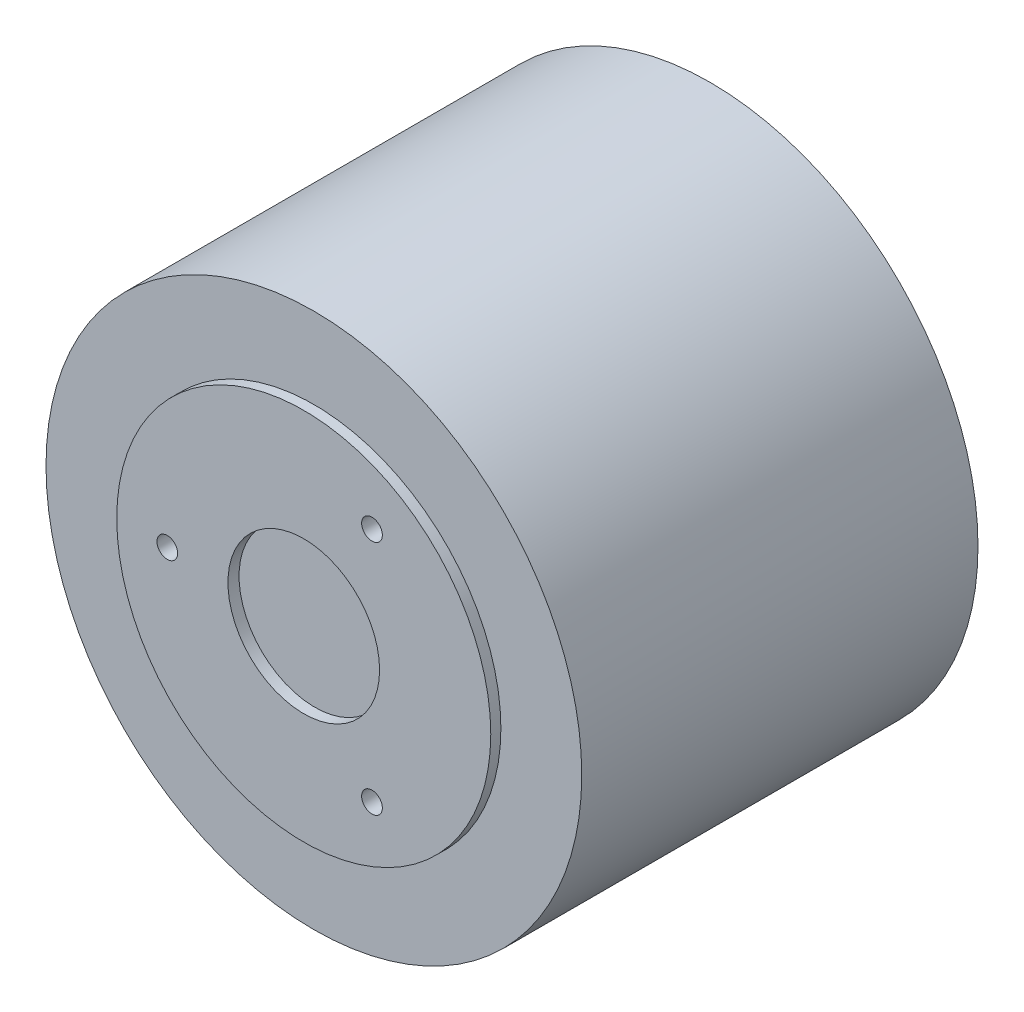
ISO-10303-21;
HEADER;
FILE_DESCRIPTION(('STEP AP214'),'2;1');
FILE_NAME('part.step','',(''),(''),'','','');
FILE_SCHEMA(('AUTOMOTIVE_DESIGN { 1 0 10303 214 1 1 1 1 }'));
ENDSEC;
DATA;
#1=APPLICATION_CONTEXT('core data for automotive mechanical design processes');
#2=APPLICATION_PROTOCOL_DEFINITION('international standard','automotive_design',2000,#1);
#3=PRODUCT_CONTEXT('',#1,'mechanical');
#4=PRODUCT('Part','Part','',(#3));
#5=PRODUCT_RELATED_PRODUCT_CATEGORY('part','',(#4));
#6=PRODUCT_DEFINITION_FORMATION('','',#4);
#7=PRODUCT_DEFINITION_CONTEXT('part definition',#1,'design');
#8=PRODUCT_DEFINITION('design','',#6,#7);
#9=PRODUCT_DEFINITION_SHAPE('','',#8);
#10=(LENGTH_UNIT() NAMED_UNIT(*) SI_UNIT(.MILLI.,.METRE.));
#11=(NAMED_UNIT(*) PLANE_ANGLE_UNIT() SI_UNIT($,.RADIAN.));
#12=(NAMED_UNIT(*) SI_UNIT($,.STERADIAN.) SOLID_ANGLE_UNIT());
#13=UNCERTAINTY_MEASURE_WITH_UNIT(LENGTH_MEASURE(1.E-05),#10,'distance_accuracy_value','');
#14=(GEOMETRIC_REPRESENTATION_CONTEXT(3) GLOBAL_UNCERTAINTY_ASSIGNED_CONTEXT((#13)) GLOBAL_UNIT_ASSIGNED_CONTEXT((#10,
#11,#12)) REPRESENTATION_CONTEXT('',''));
#15=CARTESIAN_POINT('',(0.,0.,0.));
#16=DIRECTION('',(0.,0.,1.));
#17=DIRECTION('',(1.,0.,0.));
#18=AXIS2_PLACEMENT_3D('',#15,#16,#17);
#19=CARTESIAN_POINT('',(0.,0.,-1.));
#20=DIRECTION('',(0.,0.,-1.));
#21=DIRECTION('',(-1.,0.,0.));
#22=AXIS2_PLACEMENT_3D('',#19,#20,#21);
#23=CYLINDRICAL_SURFACE('',#22,26.5);
#24=CARTESIAN_POINT('',(0.,0.,-1.));
#25=DIRECTION('',(0.,0.,1.));
#26=DIRECTION('',(1.,0.,0.));
#27=AXIS2_PLACEMENT_3D('',#24,#25,#26);
#28=CIRCLE('',#27,26.5);
#29=CARTESIAN_POINT('',(26.5,0.,-1.));
#30=VERTEX_POINT('',#29);
#31=EDGE_CURVE('E10',#30,#30,#28,.T.);
#32=ORIENTED_EDGE('',*,*,#31,.F.);
#33=EDGE_LOOP('',(#32));
#34=FACE_BOUND('',#33,.T.);
#35=CARTESIAN_POINT('',(0.,0.,-40.2));
#36=DIRECTION('',(0.,0.,1.));
#37=DIRECTION('',(1.,0.,0.));
#38=AXIS2_PLACEMENT_3D('',#35,#36,#37);
#39=CIRCLE('',#38,26.5);
#40=CARTESIAN_POINT('',(26.5,0.,-40.2));
#41=VERTEX_POINT('',#40);
#42=EDGE_CURVE('E48',#41,#41,#39,.T.);
#43=ORIENTED_EDGE('',*,*,#42,.T.);
#44=EDGE_LOOP('',(#43));
#45=FACE_BOUND('',#44,.T.);
#46=ADVANCED_FACE('F41',(#34,#45),#23,.T.);
#47=CARTESIAN_POINT('',(0.,0.,-1.));
#48=DIRECTION('',(0.,0.,1.));
#49=DIRECTION('',(1.,0.,0.));
#50=AXIS2_PLACEMENT_3D('',#47,#48,#49);
#51=PLANE('',#50);
#52=CARTESIAN_POINT('',(0.,0.,-1.));
#53=DIRECTION('',(0.,0.,1.));
#54=DIRECTION('',(1.,0.,0.));
#55=AXIS2_PLACEMENT_3D('',#52,#53,#54);
#56=CIRCLE('',#55,18.5);
#57=CARTESIAN_POINT('',(18.5,0.,-1.));
#58=VERTEX_POINT('',#57);
#59=EDGE_CURVE('E44',#58,#58,#56,.F.);
#60=ORIENTED_EDGE('',*,*,#59,.T.);
#61=EDGE_LOOP('',(#60));
#62=FACE_BOUND('',#61,.T.);
#63=ORIENTED_EDGE('',*,*,#31,.T.);
#64=EDGE_LOOP('',(#63));
#65=FACE_BOUND('',#64,.T.);
#66=ADVANCED_FACE('F118',(#62,#65),#51,.T.);
#67=CARTESIAN_POINT('',(0.,0.,-40.2));
#68=DIRECTION('',(0.,0.,1.));
#69=DIRECTION('',(1.,0.,0.));
#70=AXIS2_PLACEMENT_3D('',#67,#68,#69);
#71=PLANE('',#70);
#72=CARTESIAN_POINT('',(-23.5,0.,-40.2));
#73=DIRECTION('',(0.,0.,1.));
#74=DIRECTION('',(1.,0.,0.));
#75=AXIS2_PLACEMENT_3D('',#72,#73,#74);
#76=CIRCLE('',#75,1.025);
#77=CARTESIAN_POINT('',(-22.475,0.,-40.2));
#78=VERTEX_POINT('',#77);
#79=EDGE_CURVE('E100',#78,#78,#76,.T.);
#80=ORIENTED_EDGE('',*,*,#79,.T.);
#81=EDGE_LOOP('',(#80));
#82=FACE_BOUND('',#81,.T.);
#83=CARTESIAN_POINT('',(0.,-23.5,-40.2));
#84=DIRECTION('',(0.,0.,1.));
#85=DIRECTION('',(1.,0.,0.));
#86=AXIS2_PLACEMENT_3D('',#83,#84,#85);
#87=CIRCLE('',#86,1.025);
#88=CARTESIAN_POINT('',(1.025,-23.5,-40.2));
#89=VERTEX_POINT('',#88);
#90=EDGE_CURVE('E94',#89,#89,#87,.T.);
#91=ORIENTED_EDGE('',*,*,#90,.T.);
#92=EDGE_LOOP('',(#91));
#93=FACE_BOUND('',#92,.T.);
#94=CARTESIAN_POINT('',(23.5,0.,-40.2));
#95=DIRECTION('',(0.,0.,1.));
#96=DIRECTION('',(1.,0.,0.));
#97=AXIS2_PLACEMENT_3D('',#94,#95,#96);
#98=CIRCLE('',#97,1.025);
#99=CARTESIAN_POINT('',(24.525,0.,-40.2));
#100=VERTEX_POINT('',#99);
#101=EDGE_CURVE('E88',#100,#100,#98,.T.);
#102=ORIENTED_EDGE('',*,*,#101,.T.);
#103=EDGE_LOOP('',(#102));
#104=FACE_BOUND('',#103,.T.);
#105=CARTESIAN_POINT('',(0.,23.5,-40.2));
#106=DIRECTION('',(0.,0.,1.));
#107=DIRECTION('',(1.,0.,0.));
#108=AXIS2_PLACEMENT_3D('',#105,#106,#107);
#109=CIRCLE('',#108,1.025);
#110=CARTESIAN_POINT('',(1.025,23.5,-40.2));
#111=VERTEX_POINT('',#110);
#112=EDGE_CURVE('E82',#111,#111,#109,.T.);
#113=ORIENTED_EDGE('',*,*,#112,.T.);
#114=EDGE_LOOP('',(#113));
#115=FACE_BOUND('',#114,.T.);
#116=ORIENTED_EDGE('',*,*,#42,.F.);
#117=EDGE_LOOP('',(#116));
#118=FACE_BOUND('',#117,.T.);
#119=ADVANCED_FACE('F123',(#82,#93,#104,#115,#118),#71,.F.);
#120=CARTESIAN_POINT('',(0.,0.,0.));
#121=DIRECTION('',(0.,0.,-1.));
#122=DIRECTION('',(-1.,0.,0.));
#123=AXIS2_PLACEMENT_3D('',#120,#121,#122);
#124=CYLINDRICAL_SURFACE('',#123,18.5);
#125=ORIENTED_EDGE('',*,*,#59,.F.);
#126=EDGE_LOOP('',(#125));
#127=FACE_BOUND('',#126,.T.);
#128=CARTESIAN_POINT('',(0.,0.,0.));
#129=DIRECTION('',(0.,0.,1.));
#130=DIRECTION('',(1.,0.,0.));
#131=AXIS2_PLACEMENT_3D('',#128,#129,#130);
#132=CIRCLE('',#131,18.5);
#133=CARTESIAN_POINT('',(18.5,0.,0.));
#134=VERTEX_POINT('',#133);
#135=EDGE_CURVE('E54',#134,#134,#132,.T.);
#136=ORIENTED_EDGE('',*,*,#135,.F.);
#137=EDGE_LOOP('',(#136));
#138=FACE_BOUND('',#137,.T.);
#139=ADVANCED_FACE('F130',(#127,#138),#124,.T.);
#140=CARTESIAN_POINT('',(0.,0.,0.));
#141=DIRECTION('',(0.,0.,1.));
#142=DIRECTION('',(1.,0.,0.));
#143=AXIS2_PLACEMENT_3D('',#140,#141,#142);
#144=PLANE('',#143);
#145=CARTESIAN_POINT('',(-13.5,0.,0.));
#146=DIRECTION('',(0.,0.,1.));
#147=DIRECTION('',(1.,0.,0.));
#148=AXIS2_PLACEMENT_3D('',#145,#146,#147);
#149=CIRCLE('',#148,1.025);
#150=CARTESIAN_POINT('',(-12.475,0.,0.));
#151=VERTEX_POINT('',#150);
#152=EDGE_CURVE('E73',#151,#151,#149,.T.);
#153=ORIENTED_EDGE('',*,*,#152,.F.);
#154=EDGE_LOOP('',(#153));
#155=FACE_BOUND('',#154,.T.);
#156=CARTESIAN_POINT('',(6.75,-11.6913429510899,0.));
#157=DIRECTION('',(0.,0.,1.));
#158=DIRECTION('',(1.,0.,0.));
#159=AXIS2_PLACEMENT_3D('',#156,#157,#158);
#160=CIRCLE('',#159,1.025);
#161=CARTESIAN_POINT('',(7.775,-11.6913429510899,0.));
#162=VERTEX_POINT('',#161);
#163=EDGE_CURVE('E67',#162,#162,#160,.T.);
#164=ORIENTED_EDGE('',*,*,#163,.F.);
#165=EDGE_LOOP('',(#164));
#166=FACE_BOUND('',#165,.T.);
#167=CARTESIAN_POINT('',(6.75,11.6913429510899,0.));
#168=DIRECTION('',(0.,0.,1.));
#169=DIRECTION('',(1.,0.,0.));
#170=AXIS2_PLACEMENT_3D('',#167,#168,#169);
#171=CIRCLE('',#170,1.025);
#172=CARTESIAN_POINT('',(7.775,11.6913429510899,0.));
#173=VERTEX_POINT('',#172);
#174=EDGE_CURVE('E61',#173,#173,#171,.T.);
#175=ORIENTED_EDGE('',*,*,#174,.F.);
#176=EDGE_LOOP('',(#175));
#177=FACE_BOUND('',#176,.T.);
#178=CARTESIAN_POINT('',(0.,0.,0.));
#179=DIRECTION('',(0.,0.,1.));
#180=DIRECTION('',(1.,0.,0.));
#181=AXIS2_PLACEMENT_3D('',#178,#179,#180);
#182=CIRCLE('',#181,7.5);
#183=CARTESIAN_POINT('',(7.5,0.,0.));
#184=VERTEX_POINT('',#183);
#185=EDGE_CURVE('E57',#184,#184,#182,.T.);
#186=ORIENTED_EDGE('',*,*,#185,.F.);
#187=EDGE_LOOP('',(#186));
#188=FACE_BOUND('',#187,.T.);
#189=ORIENTED_EDGE('',*,*,#135,.T.);
#190=EDGE_LOOP('',(#189));
#191=FACE_BOUND('',#190,.T.);
#192=ADVANCED_FACE('F135',(#155,#166,#177,#188,#191),#144,.T.);
#193=CARTESIAN_POINT('',(0.,0.,0.));
#194=DIRECTION('',(0.,0.,-1.));
#195=DIRECTION('',(-1.,0.,0.));
#196=AXIS2_PLACEMENT_3D('',#193,#194,#195);
#197=CYLINDRICAL_SURFACE('',#196,7.5);
#198=ORIENTED_EDGE('',*,*,#185,.T.);
#199=EDGE_LOOP('',(#198));
#200=FACE_BOUND('',#199,.T.);
#201=CARTESIAN_POINT('',(0.,0.,-1.1));
#202=DIRECTION('',(0.,0.,1.));
#203=DIRECTION('',(1.,0.,0.));
#204=AXIS2_PLACEMENT_3D('',#201,#202,#203);
#205=CIRCLE('',#204,7.5);
#206=CARTESIAN_POINT('',(7.5,0.,-1.1));
#207=VERTEX_POINT('',#206);
#208=EDGE_CURVE('E58',#207,#207,#205,.T.);
#209=ORIENTED_EDGE('',*,*,#208,.F.);
#210=EDGE_LOOP('',(#209));
#211=FACE_BOUND('',#210,.T.);
#212=ADVANCED_FACE('F142',(#200,#211),#197,.F.);
#213=CARTESIAN_POINT('',(0.,0.,-1.1));
#214=DIRECTION('',(0.,0.,1.));
#215=DIRECTION('',(1.,0.,0.));
#216=AXIS2_PLACEMENT_3D('',#213,#214,#215);
#217=PLANE('',#216);
#218=ORIENTED_EDGE('',*,*,#208,.T.);
#219=EDGE_LOOP('',(#218));
#220=FACE_BOUND('',#219,.T.);
#221=ADVANCED_FACE('F146',(#220),#217,.T.);
#222=CARTESIAN_POINT('',(6.75,11.6913429510899,0.));
#223=DIRECTION('',(0.,0.,-1.));
#224=DIRECTION('',(-1.,0.,0.));
#225=AXIS2_PLACEMENT_3D('',#222,#223,#224);
#226=CYLINDRICAL_SURFACE('',#225,1.025);
#227=ORIENTED_EDGE('',*,*,#174,.T.);
#228=EDGE_LOOP('',(#227));
#229=FACE_BOUND('',#228,.T.);
#230=CARTESIAN_POINT('',(6.75,11.6913429510899,-3.));
#231=DIRECTION('',(0.,0.,1.));
#232=DIRECTION('',(1.,0.,0.));
#233=AXIS2_PLACEMENT_3D('',#230,#231,#232);
#234=CIRCLE('',#233,1.025);
#235=CARTESIAN_POINT('',(7.775,11.6913429510899,-3.));
#236=VERTEX_POINT('',#235);
#237=EDGE_CURVE('E64',#236,#236,#234,.T.);
#238=ORIENTED_EDGE('',*,*,#237,.F.);
#239=EDGE_LOOP('',(#238));
#240=FACE_BOUND('',#239,.T.);
#241=ADVANCED_FACE('F150',(#229,#240),#226,.F.);
#242=CARTESIAN_POINT('',(6.75,11.6913429510899,-3.));
#243=DIRECTION('',(0.,0.,1.));
#244=DIRECTION('',(1.,0.,0.));
#245=AXIS2_PLACEMENT_3D('',#242,#243,#244);
#246=PLANE('',#245);
#247=ORIENTED_EDGE('',*,*,#237,.T.);
#248=EDGE_LOOP('',(#247));
#249=FACE_BOUND('',#248,.T.);
#250=ADVANCED_FACE('F154',(#249),#246,.T.);
#251=CARTESIAN_POINT('',(6.75,-11.6913429510899,0.));
#252=DIRECTION('',(0.,0.,-1.));
#253=DIRECTION('',(-1.,0.,0.));
#254=AXIS2_PLACEMENT_3D('',#251,#252,#253);
#255=CYLINDRICAL_SURFACE('',#254,1.025);
#256=ORIENTED_EDGE('',*,*,#163,.T.);
#257=EDGE_LOOP('',(#256));
#258=FACE_BOUND('',#257,.T.);
#259=CARTESIAN_POINT('',(6.75,-11.6913429510899,-3.));
#260=DIRECTION('',(0.,0.,1.));
#261=DIRECTION('',(1.,0.,0.));
#262=AXIS2_PLACEMENT_3D('',#259,#260,#261);
#263=CIRCLE('',#262,1.025);
#264=CARTESIAN_POINT('',(7.775,-11.6913429510899,-3.));
#265=VERTEX_POINT('',#264);
#266=EDGE_CURVE('E70',#265,#265,#263,.T.);
#267=ORIENTED_EDGE('',*,*,#266,.F.);
#268=EDGE_LOOP('',(#267));
#269=FACE_BOUND('',#268,.T.);
#270=ADVANCED_FACE('F158',(#258,#269),#255,.F.);
#271=CARTESIAN_POINT('',(6.75,-11.6913429510899,-3.));
#272=DIRECTION('',(0.,0.,1.));
#273=DIRECTION('',(1.,0.,0.));
#274=AXIS2_PLACEMENT_3D('',#271,#272,#273);
#275=PLANE('',#274);
#276=ORIENTED_EDGE('',*,*,#266,.T.);
#277=EDGE_LOOP('',(#276));
#278=FACE_BOUND('',#277,.T.);
#279=ADVANCED_FACE('F162',(#278),#275,.T.);
#280=CARTESIAN_POINT('',(-13.5,0.,0.));
#281=DIRECTION('',(0.,0.,-1.));
#282=DIRECTION('',(-1.,0.,0.));
#283=AXIS2_PLACEMENT_3D('',#280,#281,#282);
#284=CYLINDRICAL_SURFACE('',#283,1.025);
#285=ORIENTED_EDGE('',*,*,#152,.T.);
#286=EDGE_LOOP('',(#285));
#287=FACE_BOUND('',#286,.T.);
#288=CARTESIAN_POINT('',(-13.5,0.,-3.));
#289=DIRECTION('',(0.,0.,1.));
#290=DIRECTION('',(1.,0.,0.));
#291=AXIS2_PLACEMENT_3D('',#288,#289,#290);
#292=CIRCLE('',#291,1.025);
#293=CARTESIAN_POINT('',(-12.475,0.,-3.));
#294=VERTEX_POINT('',#293);
#295=EDGE_CURVE('E76',#294,#294,#292,.T.);
#296=ORIENTED_EDGE('',*,*,#295,.F.);
#297=EDGE_LOOP('',(#296));
#298=FACE_BOUND('',#297,.T.);
#299=ADVANCED_FACE('F166',(#287,#298),#284,.F.);
#300=CARTESIAN_POINT('',(-13.5,0.,-3.));
#301=DIRECTION('',(0.,0.,1.));
#302=DIRECTION('',(1.,0.,0.));
#303=AXIS2_PLACEMENT_3D('',#300,#301,#302);
#304=PLANE('',#303);
#305=ORIENTED_EDGE('',*,*,#295,.T.);
#306=EDGE_LOOP('',(#305));
#307=FACE_BOUND('',#306,.T.);
#308=ADVANCED_FACE('F170',(#307),#304,.T.);
#309=CARTESIAN_POINT('',(0.,23.5,-35.2));
#310=DIRECTION('',(0.,0.,-1.));
#311=DIRECTION('',(-1.,0.,0.));
#312=AXIS2_PLACEMENT_3D('',#309,#310,#311);
#313=CYLINDRICAL_SURFACE('',#312,1.025);
#314=CARTESIAN_POINT('',(0.,23.5,-35.2));
#315=DIRECTION('',(0.,0.,1.));
#316=DIRECTION('',(1.,0.,0.));
#317=AXIS2_PLACEMENT_3D('',#314,#315,#316);
#318=CIRCLE('',#317,1.025);
#319=CARTESIAN_POINT('',(1.025,23.5,-35.2));
#320=VERTEX_POINT('',#319);
#321=EDGE_CURVE('E79',#320,#320,#318,.T.);
#322=ORIENTED_EDGE('',*,*,#321,.T.);
#323=EDGE_LOOP('',(#322));
#324=FACE_BOUND('',#323,.T.);
#325=ORIENTED_EDGE('',*,*,#112,.F.);
#326=EDGE_LOOP('',(#325));
#327=FACE_BOUND('',#326,.T.);
#328=ADVANCED_FACE('F174',(#324,#327),#313,.F.);
#329=CARTESIAN_POINT('',(0.,23.5,-35.2));
#330=DIRECTION('',(0.,0.,1.));
#331=DIRECTION('',(1.,0.,0.));
#332=AXIS2_PLACEMENT_3D('',#329,#330,#331);
#333=PLANE('',#332);
#334=ORIENTED_EDGE('',*,*,#321,.F.);
#335=EDGE_LOOP('',(#334));
#336=FACE_BOUND('',#335,.T.);
#337=ADVANCED_FACE('F178',(#336),#333,.F.);
#338=CARTESIAN_POINT('',(23.5,0.,-35.2));
#339=DIRECTION('',(0.,0.,-1.));
#340=DIRECTION('',(-1.,0.,0.));
#341=AXIS2_PLACEMENT_3D('',#338,#339,#340);
#342=CYLINDRICAL_SURFACE('',#341,1.025);
#343=CARTESIAN_POINT('',(23.5,0.,-35.2));
#344=DIRECTION('',(0.,0.,1.));
#345=DIRECTION('',(1.,0.,0.));
#346=AXIS2_PLACEMENT_3D('',#343,#344,#345);
#347=CIRCLE('',#346,1.025);
#348=CARTESIAN_POINT('',(24.525,0.,-35.2));
#349=VERTEX_POINT('',#348);
#350=EDGE_CURVE('E85',#349,#349,#347,.T.);
#351=ORIENTED_EDGE('',*,*,#350,.T.);
#352=EDGE_LOOP('',(#351));
#353=FACE_BOUND('',#352,.T.);
#354=ORIENTED_EDGE('',*,*,#101,.F.);
#355=EDGE_LOOP('',(#354));
#356=FACE_BOUND('',#355,.T.);
#357=ADVANCED_FACE('F182',(#353,#356),#342,.F.);
#358=CARTESIAN_POINT('',(23.5,0.,-35.2));
#359=DIRECTION('',(0.,0.,1.));
#360=DIRECTION('',(1.,0.,0.));
#361=AXIS2_PLACEMENT_3D('',#358,#359,#360);
#362=PLANE('',#361);
#363=ORIENTED_EDGE('',*,*,#350,.F.);
#364=EDGE_LOOP('',(#363));
#365=FACE_BOUND('',#364,.T.);
#366=ADVANCED_FACE('F186',(#365),#362,.F.);
#367=CARTESIAN_POINT('',(0.,-23.5,-35.2));
#368=DIRECTION('',(0.,0.,-1.));
#369=DIRECTION('',(-1.,0.,0.));
#370=AXIS2_PLACEMENT_3D('',#367,#368,#369);
#371=CYLINDRICAL_SURFACE('',#370,1.025);
#372=CARTESIAN_POINT('',(0.,-23.5,-35.2));
#373=DIRECTION('',(0.,0.,1.));
#374=DIRECTION('',(1.,0.,0.));
#375=AXIS2_PLACEMENT_3D('',#372,#373,#374);
#376=CIRCLE('',#375,1.025);
#377=CARTESIAN_POINT('',(1.025,-23.5,-35.2));
#378=VERTEX_POINT('',#377);
#379=EDGE_CURVE('E91',#378,#378,#376,.T.);
#380=ORIENTED_EDGE('',*,*,#379,.T.);
#381=EDGE_LOOP('',(#380));
#382=FACE_BOUND('',#381,.T.);
#383=ORIENTED_EDGE('',*,*,#90,.F.);
#384=EDGE_LOOP('',(#383));
#385=FACE_BOUND('',#384,.T.);
#386=ADVANCED_FACE('F190',(#382,#385),#371,.F.);
#387=CARTESIAN_POINT('',(0.,-23.5,-35.2));
#388=DIRECTION('',(0.,0.,1.));
#389=DIRECTION('',(1.,0.,0.));
#390=AXIS2_PLACEMENT_3D('',#387,#388,#389);
#391=PLANE('',#390);
#392=ORIENTED_EDGE('',*,*,#379,.F.);
#393=EDGE_LOOP('',(#392));
#394=FACE_BOUND('',#393,.T.);
#395=ADVANCED_FACE('F115',(#394),#391,.F.);
#396=CARTESIAN_POINT('',(-23.5,0.,-35.2));
#397=DIRECTION('',(0.,0.,-1.));
#398=DIRECTION('',(-1.,0.,0.));
#399=AXIS2_PLACEMENT_3D('',#396,#397,#398);
#400=CYLINDRICAL_SURFACE('',#399,1.025);
#401=CARTESIAN_POINT('',(-23.5,0.,-35.2));
#402=DIRECTION('',(0.,0.,1.));
#403=DIRECTION('',(1.,0.,0.));
#404=AXIS2_PLACEMENT_3D('',#401,#402,#403);
#405=CIRCLE('',#404,1.025);
#406=CARTESIAN_POINT('',(-22.475,0.,-35.2));
#407=VERTEX_POINT('',#406);
#408=EDGE_CURVE('E97',#407,#407,#405,.T.);
#409=ORIENTED_EDGE('',*,*,#408,.T.);
#410=EDGE_LOOP('',(#409));
#411=FACE_BOUND('',#410,.T.);
#412=ORIENTED_EDGE('',*,*,#79,.F.);
#413=EDGE_LOOP('',(#412));
#414=FACE_BOUND('',#413,.T.);
#415=ADVANCED_FACE('F106',(#411,#414),#400,.F.);
#416=CARTESIAN_POINT('',(-23.5,0.,-35.2));
#417=DIRECTION('',(0.,0.,1.));
#418=DIRECTION('',(1.,0.,0.));
#419=AXIS2_PLACEMENT_3D('',#416,#417,#418);
#420=PLANE('',#419);
#421=ORIENTED_EDGE('',*,*,#408,.F.);
#422=EDGE_LOOP('',(#421));
#423=FACE_BOUND('',#422,.T.);
#424=ADVANCED_FACE('F109',(#423),#420,.F.);
#425=CLOSED_SHELL('',(#46,#66,#119,#139,#192,#212,#221,#241,#250,#270,#279,#299,#308,#328,#337,
#357,#366,#386,#395,#415,#424));
#426=MANIFOLD_SOLID_BREP('B2',#425);
#427=ADVANCED_BREP_SHAPE_REPRESENTATION('',(#18,#426),#14);
#428=SHAPE_DEFINITION_REPRESENTATION(#9,#427);
ENDSEC;
END-ISO-10303-21;
